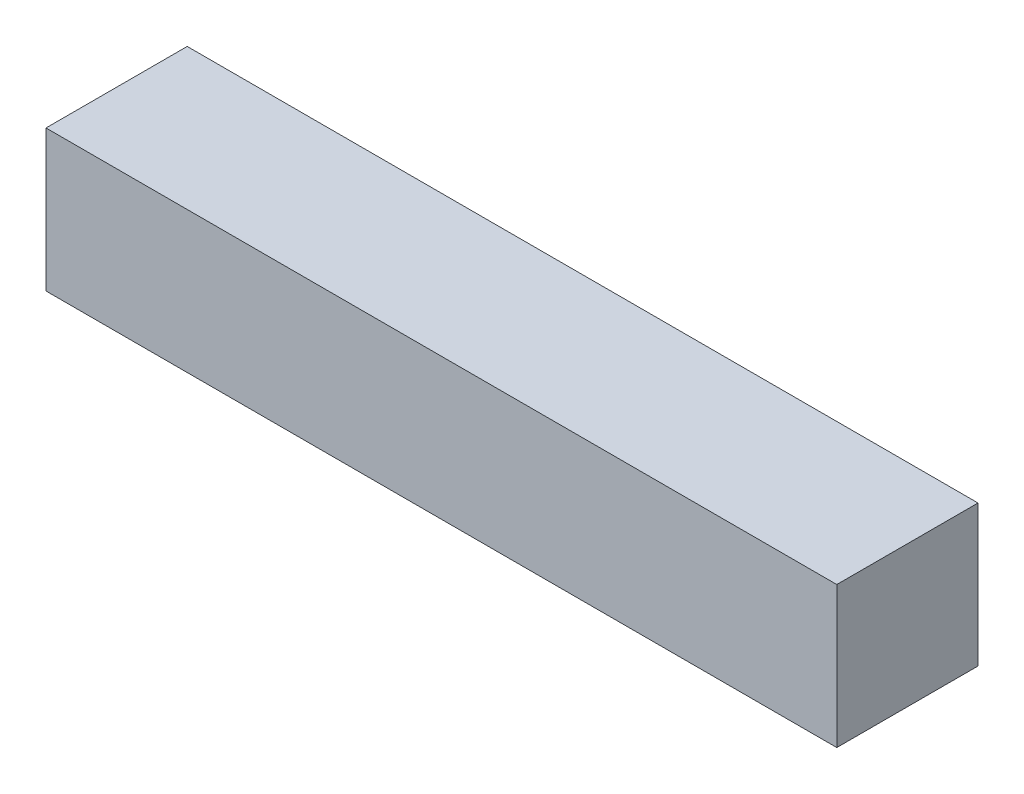
ISO-10303-21;
HEADER;
FILE_DESCRIPTION(('STEP AP214'),'2;1');
FILE_NAME('part.step','',(''),(''),'','','');
FILE_SCHEMA(('AUTOMOTIVE_DESIGN { 1 0 10303 214 1 1 1 1 }'));
ENDSEC;
DATA;
#1=APPLICATION_CONTEXT('core data for automotive mechanical design processes');
#2=APPLICATION_PROTOCOL_DEFINITION('international standard','automotive_design',2000,#1);
#3=PRODUCT_CONTEXT('',#1,'mechanical');
#4=PRODUCT('Part','Part','',(#3));
#5=PRODUCT_RELATED_PRODUCT_CATEGORY('part','',(#4));
#6=PRODUCT_DEFINITION_FORMATION('','',#4);
#7=PRODUCT_DEFINITION_CONTEXT('part definition',#1,'design');
#8=PRODUCT_DEFINITION('design','',#6,#7);
#9=PRODUCT_DEFINITION_SHAPE('','',#8);
#10=(LENGTH_UNIT() NAMED_UNIT(*) SI_UNIT(.MILLI.,.METRE.));
#11=(NAMED_UNIT(*) PLANE_ANGLE_UNIT() SI_UNIT($,.RADIAN.));
#12=(NAMED_UNIT(*) SI_UNIT($,.STERADIAN.) SOLID_ANGLE_UNIT());
#13=UNCERTAINTY_MEASURE_WITH_UNIT(LENGTH_MEASURE(1.E-05),#10,'distance_accuracy_value','');
#14=(GEOMETRIC_REPRESENTATION_CONTEXT(3) GLOBAL_UNCERTAINTY_ASSIGNED_CONTEXT((#13)) GLOBAL_UNIT_ASSIGNED_CONTEXT((#10,
#11,#12)) REPRESENTATION_CONTEXT('',''));
#15=CARTESIAN_POINT('',(0.,0.,0.));
#16=DIRECTION('',(0.,0.,1.));
#17=DIRECTION('',(1.,0.,0.));
#18=AXIS2_PLACEMENT_3D('',#15,#16,#17);
#19=CARTESIAN_POINT('',(11.2,4.,2.));
#20=DIRECTION('',(-1.,0.,0.));
#21=DIRECTION('',(0.,0.,1.));
#22=AXIS2_PLACEMENT_3D('',#19,#20,#21);
#23=PLANE('',#22);
#24=DIRECTION('',(0.,0.,-1.));
#25=VECTOR('',#24,1.);
#26=CARTESIAN_POINT('',(11.2,0.,2.));
#27=LINE('',#26,#25);
#28=CARTESIAN_POINT('',(11.2,0.,2.));
#29=VERTEX_POINT('',#28);
#30=CARTESIAN_POINT('',(11.2,0.,-2.));
#31=VERTEX_POINT('',#30);
#32=EDGE_CURVE('E111',#29,#31,#27,.T.);
#33=ORIENTED_EDGE('',*,*,#32,.T.);
#34=DIRECTION('',(0.,-1.,0.));
#35=VECTOR('',#34,1.);
#36=CARTESIAN_POINT('',(11.2,4.,-2.));
#37=LINE('',#36,#35);
#38=CARTESIAN_POINT('',(11.2,4.,-2.));
#39=VERTEX_POINT('',#38);
#40=EDGE_CURVE('E11',#39,#31,#37,.T.);
#41=ORIENTED_EDGE('',*,*,#40,.F.);
#42=DIRECTION('',(0.,0.,-1.));
#43=VECTOR('',#42,1.);
#44=CARTESIAN_POINT('',(11.2,4.,2.));
#45=LINE('',#44,#43);
#46=CARTESIAN_POINT('',(11.2,4.,2.));
#47=VERTEX_POINT('',#46);
#48=EDGE_CURVE('E95',#47,#39,#45,.T.);
#49=ORIENTED_EDGE('',*,*,#48,.F.);
#50=DIRECTION('',(0.,-1.,0.));
#51=VECTOR('',#50,1.);
#52=CARTESIAN_POINT('',(11.2,4.,2.));
#53=LINE('',#52,#51);
#54=EDGE_CURVE('E107',#47,#29,#53,.T.);
#55=ORIENTED_EDGE('',*,*,#54,.T.);
#56=EDGE_LOOP('',(#33,#41,#49,#55));
#57=FACE_BOUND('',#56,.T.);
#58=ADVANCED_FACE('F43',(#57),#23,.F.);
#59=CARTESIAN_POINT('',(-11.2,4.,-2.));
#60=DIRECTION('',(0.,0.,1.));
#61=DIRECTION('',(1.,0.,0.));
#62=AXIS2_PLACEMENT_3D('',#59,#60,#61);
#63=PLANE('',#62);
#64=DIRECTION('',(-1.,0.,0.));
#65=VECTOR('',#64,1.);
#66=CARTESIAN_POINT('',(-11.2,0.,-2.));
#67=LINE('',#66,#65);
#68=CARTESIAN_POINT('',(-11.2,0.,-2.));
#69=VERTEX_POINT('',#68);
#70=EDGE_CURVE('E100',#31,#69,#67,.T.);
#71=ORIENTED_EDGE('',*,*,#70,.T.);
#72=DIRECTION('',(0.,-1.,0.));
#73=VECTOR('',#72,1.);
#74=CARTESIAN_POINT('',(-11.2,4.,-2.));
#75=LINE('',#74,#73);
#76=CARTESIAN_POINT('',(-11.2,4.,-2.));
#77=VERTEX_POINT('',#76);
#78=EDGE_CURVE('E52',#77,#69,#75,.T.);
#79=ORIENTED_EDGE('',*,*,#78,.F.);
#80=DIRECTION('',(-1.,0.,0.));
#81=VECTOR('',#80,1.);
#82=CARTESIAN_POINT('',(-11.2,4.,-2.));
#83=LINE('',#82,#81);
#84=EDGE_CURVE('E90',#39,#77,#83,.T.);
#85=ORIENTED_EDGE('',*,*,#84,.F.);
#86=ORIENTED_EDGE('',*,*,#40,.T.);
#87=EDGE_LOOP('',(#71,#79,#85,#86));
#88=FACE_BOUND('',#87,.T.);
#89=ADVANCED_FACE('F99',(#88),#63,.F.);
#90=CARTESIAN_POINT('',(-11.2,4.,2.));
#91=DIRECTION('',(1.,0.,0.));
#92=DIRECTION('',(0.,0.,-1.));
#93=AXIS2_PLACEMENT_3D('',#90,#91,#92);
#94=PLANE('',#93);
#95=DIRECTION('',(0.,0.,1.));
#96=VECTOR('',#95,1.);
#97=CARTESIAN_POINT('',(-11.2,0.,2.));
#98=LINE('',#97,#96);
#99=CARTESIAN_POINT('',(-11.2,0.,2.));
#100=VERTEX_POINT('',#99);
#101=EDGE_CURVE('E77',#69,#100,#98,.T.);
#102=ORIENTED_EDGE('',*,*,#101,.T.);
#103=DIRECTION('',(0.,-1.,0.));
#104=VECTOR('',#103,1.);
#105=CARTESIAN_POINT('',(-11.2,4.,2.));
#106=LINE('',#105,#104);
#107=CARTESIAN_POINT('',(-11.2,4.,2.));
#108=VERTEX_POINT('',#107);
#109=EDGE_CURVE('E102',#108,#100,#106,.T.);
#110=ORIENTED_EDGE('',*,*,#109,.F.);
#111=DIRECTION('',(0.,0.,1.));
#112=VECTOR('',#111,1.);
#113=CARTESIAN_POINT('',(-11.2,4.,2.));
#114=LINE('',#113,#112);
#115=EDGE_CURVE('E93',#77,#108,#114,.T.);
#116=ORIENTED_EDGE('',*,*,#115,.F.);
#117=ORIENTED_EDGE('',*,*,#78,.T.);
#118=EDGE_LOOP('',(#102,#110,#116,#117));
#119=FACE_BOUND('',#118,.T.);
#120=ADVANCED_FACE('F103',(#119),#94,.F.);
#121=CARTESIAN_POINT('',(-11.2,4.,2.));
#122=DIRECTION('',(0.,0.,-1.));
#123=DIRECTION('',(-1.,0.,0.));
#124=AXIS2_PLACEMENT_3D('',#121,#122,#123);
#125=PLANE('',#124);
#126=DIRECTION('',(1.,0.,0.));
#127=VECTOR('',#126,1.);
#128=CARTESIAN_POINT('',(-11.2,0.,2.));
#129=LINE('',#128,#127);
#130=EDGE_CURVE('E83',#100,#29,#129,.T.);
#131=ORIENTED_EDGE('',*,*,#130,.T.);
#132=ORIENTED_EDGE('',*,*,#54,.F.);
#133=DIRECTION('',(1.,0.,0.));
#134=VECTOR('',#133,1.);
#135=CARTESIAN_POINT('',(-11.2,4.,2.));
#136=LINE('',#135,#134);
#137=EDGE_CURVE('E60',#108,#47,#136,.T.);
#138=ORIENTED_EDGE('',*,*,#137,.F.);
#139=ORIENTED_EDGE('',*,*,#109,.T.);
#140=EDGE_LOOP('',(#131,#132,#138,#139));
#141=FACE_BOUND('',#140,.T.);
#142=ADVANCED_FACE('F124',(#141),#125,.F.);
#143=CARTESIAN_POINT('',(0.,4.,0.));
#144=DIRECTION('',(0.,-1.,0.));
#145=DIRECTION('',(0.,0.,-1.));
#146=AXIS2_PLACEMENT_3D('',#143,#144,#145);
#147=PLANE('',#146);
#148=ORIENTED_EDGE('',*,*,#48,.T.);
#149=ORIENTED_EDGE('',*,*,#84,.T.);
#150=ORIENTED_EDGE('',*,*,#115,.T.);
#151=ORIENTED_EDGE('',*,*,#137,.T.);
#152=EDGE_LOOP('',(#148,#149,#150,#151));
#153=FACE_BOUND('',#152,.T.);
#154=ADVANCED_FACE('F91',(#153),#147,.F.);
#155=CARTESIAN_POINT('',(0.,0.,0.));
#156=DIRECTION('',(0.,-1.,0.));
#157=DIRECTION('',(0.,0.,-1.));
#158=AXIS2_PLACEMENT_3D('',#155,#156,#157);
#159=PLANE('',#158);
#160=ORIENTED_EDGE('',*,*,#32,.F.);
#161=ORIENTED_EDGE('',*,*,#130,.F.);
#162=ORIENTED_EDGE('',*,*,#101,.F.);
#163=ORIENTED_EDGE('',*,*,#70,.F.);
#164=EDGE_LOOP('',(#160,#161,#162,#163));
#165=FACE_BOUND('',#164,.T.);
#166=ADVANCED_FACE('F127',(#165),#159,.T.);
#167=CLOSED_SHELL('',(#58,#89,#120,#142,#154,#166));
#168=MANIFOLD_SOLID_BREP('B2',#167);
#169=ADVANCED_BREP_SHAPE_REPRESENTATION('',(#18,#168),#14);
#170=SHAPE_DEFINITION_REPRESENTATION(#9,#169);
ENDSEC;
END-ISO-10303-21;
